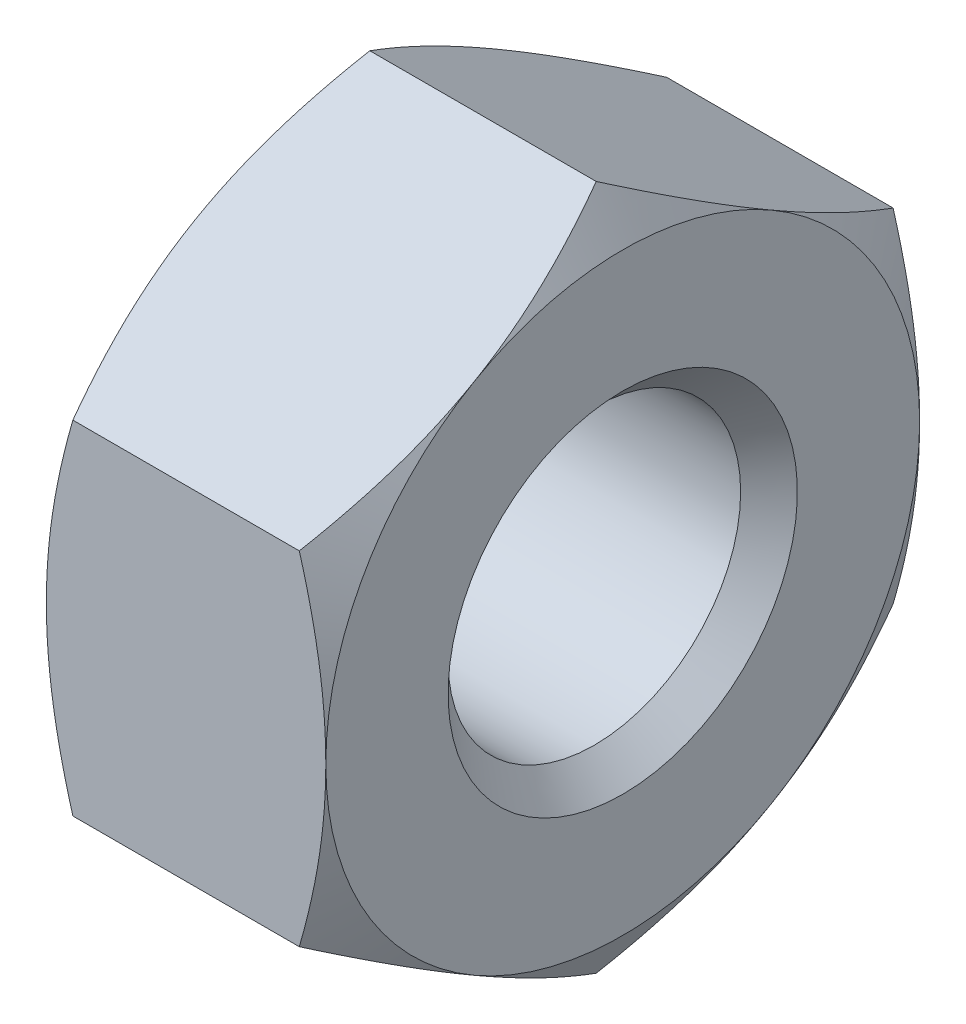
ISO-10303-21;
HEADER;
FILE_DESCRIPTION(('STEP AP214'),'2;1');
FILE_NAME('part.step','',(''),(''),'','','');
FILE_SCHEMA(('AUTOMOTIVE_DESIGN { 1 0 10303 214 1 1 1 1 }'));
ENDSEC;
DATA;
#1=APPLICATION_CONTEXT('core data for automotive mechanical design processes');
#2=APPLICATION_PROTOCOL_DEFINITION('international standard','automotive_design',2000,#1);
#3=PRODUCT_CONTEXT('',#1,'mechanical');
#4=PRODUCT('Part','Part','',(#3));
#5=PRODUCT_RELATED_PRODUCT_CATEGORY('part','',(#4));
#6=PRODUCT_DEFINITION_FORMATION('','',#4);
#7=PRODUCT_DEFINITION_CONTEXT('part definition',#1,'design');
#8=PRODUCT_DEFINITION('design','',#6,#7);
#9=PRODUCT_DEFINITION_SHAPE('','',#8);
#10=(LENGTH_UNIT() NAMED_UNIT(*) SI_UNIT(.MILLI.,.METRE.));
#11=(NAMED_UNIT(*) PLANE_ANGLE_UNIT() SI_UNIT($,.RADIAN.));
#12=(NAMED_UNIT(*) SI_UNIT($,.STERADIAN.) SOLID_ANGLE_UNIT());
#13=UNCERTAINTY_MEASURE_WITH_UNIT(LENGTH_MEASURE(1.E-05),#10,'distance_accuracy_value','');
#14=(GEOMETRIC_REPRESENTATION_CONTEXT(3) GLOBAL_UNCERTAINTY_ASSIGNED_CONTEXT((#13)) GLOBAL_UNIT_ASSIGNED_CONTEXT((#10,
#11,#12)) REPRESENTATION_CONTEXT('',''));
#15=CARTESIAN_POINT('',(0.,0.,0.));
#16=DIRECTION('',(0.,0.,1.));
#17=DIRECTION('',(1.,0.,0.));
#18=AXIS2_PLACEMENT_3D('',#15,#16,#17);
#19=CARTESIAN_POINT('',(9.,-4.90747728811182,8.5));
#20=DIRECTION('',(0.,0.866025403784439,-0.5));
#21=DIRECTION('',(0.,0.5,0.866025403784439));
#22=AXIS2_PLACEMENT_3D('',#19,#20,#21);
#23=PLANE('',#22);
#24=CARTESIAN_POINT('',(7.24081062144556,-9.81495457622367,0.));
#25=CARTESIAN_POINT('',(7.60930231810988,-9.17670823543381,1.1054750899929));
#26=CARTESIAN_POINT('',(7.79556483655696,-8.60066608617602,2.10320935980858));
#27=CARTESIAN_POINT('',(8.,-7.96842256281222,3.19828726503103));
#28=CARTESIAN_POINT('',(8.,-7.36121593216773,4.25));
#29=B_SPLINE_CURVE_WITH_KNOTS('',2,(#24,#25,#26,#27,#28),.UNSPECIFIED.,.F.,.F.,(3,2,3),(0.,0.5,
1.),.UNSPECIFIED.);
#30=CARTESIAN_POINT('',(7.24081062144515,-9.81495457622364,0.));
#31=VERTEX_POINT('',#30);
#32=CARTESIAN_POINT('',(8.,-7.36121593216773,4.25));
#33=VERTEX_POINT('',#32);
#34=EDGE_CURVE('E264',#31,#33,#29,.T.);
#35=ORIENTED_EDGE('',*,*,#34,.T.);
#36=CARTESIAN_POINT('',(8.,-7.36121593216773,4.25));
#37=CARTESIAN_POINT('',(8.,-6.7535269822711,5.30254813641915));
#38=CARTESIAN_POINT('',(7.79505900942023,-6.12020203529756,6.39949912227817));
#39=CARTESIAN_POINT('',(7.60897961351255,-5.5451646881436,7.39549302379846));
#40=CARTESIAN_POINT('',(7.24081062144536,-4.9074772881118,8.50000000000003));
#41=B_SPLINE_CURVE_WITH_KNOTS('',2,(#36,#37,#38,#39,#40),.UNSPECIFIED.,.F.,.F.,(3,2,3),(0.,0.5,
1.),.UNSPECIFIED.);
#42=CARTESIAN_POINT('',(7.24081062144515,-4.90747728811182,8.5));
#43=VERTEX_POINT('',#42);
#44=EDGE_CURVE('E127',#33,#43,#41,.T.);
#45=ORIENTED_EDGE('',*,*,#44,.T.);
#46=DIRECTION('',(-1.,0.,0.));
#47=VECTOR('',#46,1.);
#48=CARTESIAN_POINT('',(9.,-4.90747728811182,8.5));
#49=LINE('',#48,#47);
#50=CARTESIAN_POINT('',(0.759189378554848,-4.90747728811182,8.5));
#51=VERTEX_POINT('',#50);
#52=EDGE_CURVE('E125',#43,#51,#49,.T.);
#53=ORIENTED_EDGE('',*,*,#52,.T.);
#54=CARTESIAN_POINT('',(0.759189378554435,-4.90747728811179,8.50000000000005));
#55=CARTESIAN_POINT('',(0.390697681890106,-5.54572362890165,7.39452491000709));
#56=CARTESIAN_POINT('',(0.204435163443026,-6.12176577815945,6.39679064019141));
#57=CARTESIAN_POINT('',(0.,-6.75400930152325,5.30171273496894));
#58=CARTESIAN_POINT('',(0.,-7.36121593216773,4.25));
#59=B_SPLINE_CURVE_WITH_KNOTS('',2,(#54,#55,#56,#57,#58),.UNSPECIFIED.,.F.,.F.,(3,2,3),(0.,0.5,
1.),.UNSPECIFIED.);
#60=CARTESIAN_POINT('',(0.,-7.36121593216773,4.25));
#61=VERTEX_POINT('',#60);
#62=EDGE_CURVE('E108',#51,#61,#59,.T.);
#63=ORIENTED_EDGE('',*,*,#62,.T.);
#64=CARTESIAN_POINT('',(0.,-7.36121593216773,4.25));
#65=CARTESIAN_POINT('',(0.,-7.96890488206094,3.19745186358678));
#66=CARTESIAN_POINT('',(0.204940990579756,-8.6022298290379,2.10050087772182));
#67=CARTESIAN_POINT('',(0.391020386485147,-9.1772671761879,1.10450697620841));
#68=CARTESIAN_POINT('',(0.759189378554636,-9.81495457622365,0.));
#69=B_SPLINE_CURVE_WITH_KNOTS('',2,(#64,#65,#66,#67,#68),.UNSPECIFIED.,.F.,.F.,(3,2,3),(0.,0.5,
1.),.UNSPECIFIED.);
#70=CARTESIAN_POINT('',(0.759189378554846,-9.81495457622364,0.));
#71=VERTEX_POINT('',#70);
#72=EDGE_CURVE('E598',#61,#71,#69,.T.);
#73=ORIENTED_EDGE('',*,*,#72,.T.);
#74=DIRECTION('',(-1.,0.,0.));
#75=VECTOR('',#74,1.);
#76=CARTESIAN_POINT('',(9.,-9.81495457622364,0.));
#77=LINE('',#76,#75);
#78=EDGE_CURVE('E269',#31,#71,#77,.T.);
#79=ORIENTED_EDGE('',*,*,#78,.F.);
#80=EDGE_LOOP('',(#35,#45,#53,#63,#73,#79));
#81=FACE_BOUND('',#80,.T.);
#82=ADVANCED_FACE('F15',(#81),#23,.F.);
#83=CARTESIAN_POINT('',(9.,9.81495457622364,0.));
#84=DIRECTION('',(0.,-0.866025403784439,-0.5));
#85=DIRECTION('',(0.,0.5,-0.866025403784439));
#86=AXIS2_PLACEMENT_3D('',#83,#84,#85);
#87=PLANE('',#86);
#88=CARTESIAN_POINT('',(7.24081062144556,4.90747728811179,8.50000000000006));
#89=CARTESIAN_POINT('',(7.60930231810252,5.5457236288889,7.39452491002918));
#90=CARTESIAN_POINT('',(7.79556483655697,6.12176577815944,6.39679064019142));
#91=CARTESIAN_POINT('',(8.,6.75400930151223,5.30171273498803));
#92=CARTESIAN_POINT('',(8.,7.36121593216773,4.25));
#93=B_SPLINE_CURVE_WITH_KNOTS('',2,(#88,#89,#90,#91,#92),.UNSPECIFIED.,.F.,.F.,(3,2,3),(0.,0.5,
1.),.UNSPECIFIED.);
#94=CARTESIAN_POINT('',(7.24081062144515,4.90747728811182,8.5));
#95=VERTEX_POINT('',#94);
#96=CARTESIAN_POINT('',(8.,7.36121593216773,4.25));
#97=VERTEX_POINT('',#96);
#98=EDGE_CURVE('E296',#95,#97,#93,.T.);
#99=ORIENTED_EDGE('',*,*,#98,.T.);
#100=CARTESIAN_POINT('',(8.,7.36121593216773,4.25));
#101=CARTESIAN_POINT('',(8.,7.9689048820607,3.1974518635872));
#102=CARTESIAN_POINT('',(7.79505900942023,8.6022298290379,2.10050087772182));
#103=CARTESIAN_POINT('',(7.60897961351501,9.17726717618759,1.10450697620893));
#104=CARTESIAN_POINT('',(7.24081062144536,9.81495457622366,0.));
#105=B_SPLINE_CURVE_WITH_KNOTS('',2,(#100,#101,#102,#103,#104),.UNSPECIFIED.,.F.,.F.,(3,2,3),
(0.,0.5,1.),.UNSPECIFIED.);
#106=CARTESIAN_POINT('',(7.24081062144516,9.81495457622364,0.));
#107=VERTEX_POINT('',#106);
#108=EDGE_CURVE('E9',#97,#107,#105,.T.);
#109=ORIENTED_EDGE('',*,*,#108,.T.);
#110=DIRECTION('',(-1.,0.,0.));
#111=VECTOR('',#110,1.);
#112=CARTESIAN_POINT('',(9.,9.81495457622364,0.));
#113=LINE('',#112,#111);
#114=CARTESIAN_POINT('',(0.759189378554848,9.81495457622364,0.));
#115=VERTEX_POINT('',#114);
#116=EDGE_CURVE('E673',#107,#115,#113,.T.);
#117=ORIENTED_EDGE('',*,*,#116,.T.);
#118=CARTESIAN_POINT('',(0.759189378554426,9.81495457622367,0.));
#119=CARTESIAN_POINT('',(0.390697681889936,9.17670823543351,1.10547508999342));
#120=CARTESIAN_POINT('',(0.204435163443026,8.60066608617601,2.10320935980859));
#121=CARTESIAN_POINT('',(0.,7.96842256281196,3.19828726503148));
#122=CARTESIAN_POINT('',(0.,7.36121593216773,4.25));
#123=B_SPLINE_CURVE_WITH_KNOTS('',2,(#118,#119,#120,#121,#122),.UNSPECIFIED.,.F.,.F.,(3,2,3),
(0.,0.5,1.),.UNSPECIFIED.);
#124=CARTESIAN_POINT('',(0.,7.36121593216773,4.25));
#125=VERTEX_POINT('',#124);
#126=EDGE_CURVE('E464',#115,#125,#123,.T.);
#127=ORIENTED_EDGE('',*,*,#126,.T.);
#128=CARTESIAN_POINT('',(0.,7.36121593216773,4.25));
#129=CARTESIAN_POINT('',(0.,6.75352698226717,5.30254813642595));
#130=CARTESIAN_POINT('',(0.204940990579766,6.12020203529756,6.39949912227817));
#131=CARTESIAN_POINT('',(0.391020386490066,5.54516468813905,7.39549302380633));
#132=CARTESIAN_POINT('',(0.759189378554636,4.9074772881118,8.50000000000003));
#133=B_SPLINE_CURVE_WITH_KNOTS('',2,(#128,#129,#130,#131,#132),.UNSPECIFIED.,.F.,.F.,(3,2,3),
(0.,0.5,1.),.UNSPECIFIED.);
#134=CARTESIAN_POINT('',(0.759189378554848,4.90747728811182,8.5));
#135=VERTEX_POINT('',#134);
#136=EDGE_CURVE('E336',#125,#135,#133,.T.);
#137=ORIENTED_EDGE('',*,*,#136,.T.);
#138=DIRECTION('',(-1.,0.,0.));
#139=VECTOR('',#138,1.);
#140=CARTESIAN_POINT('',(9.,4.90747728811182,8.5));
#141=LINE('',#140,#139);
#142=EDGE_CURVE('E357',#95,#135,#141,.T.);
#143=ORIENTED_EDGE('',*,*,#142,.F.);
#144=EDGE_LOOP('',(#99,#109,#117,#127,#137,#143));
#145=FACE_BOUND('',#144,.T.);
#146=ADVANCED_FACE('F236',(#145),#87,.F.);
#147=CARTESIAN_POINT('',(8.,0.,0.));
#148=DIRECTION('',(-1.,0.,0.));
#149=DIRECTION('',(0.,-1.,0.));
#150=AXIS2_PLACEMENT_3D('',#147,#148,#149);
#151=CONICAL_SURFACE('',#150,8.5,1.0471975511966);
#152=CARTESIAN_POINT('',(8.,7.36121593216773,-4.25));
#153=CARTESIAN_POINT('',(8.,6.75352698226742,-5.30254813642552));
#154=CARTESIAN_POINT('',(7.79505900942023,6.12020203529756,-6.39949912227817));
#155=CARTESIAN_POINT('',(7.6089796135101,5.54516468813936,-7.3954930238058));
#156=CARTESIAN_POINT('',(7.24081062144536,4.9074772881118,-8.50000000000003));
#157=B_SPLINE_CURVE_WITH_KNOTS('',2,(#152,#153,#154,#155,#156),.UNSPECIFIED.,.F.,.F.,(3,2,3),
(0.,0.5,1.),.UNSPECIFIED.);
#158=CARTESIAN_POINT('',(8.,7.36121593216773,-4.25));
#159=VERTEX_POINT('',#158);
#160=CARTESIAN_POINT('',(7.24081062144515,4.90747728811182,-8.5));
#161=VERTEX_POINT('',#160);
#162=EDGE_CURVE('E364',#159,#161,#157,.T.);
#163=ORIENTED_EDGE('',*,*,#162,.F.);
#164=CARTESIAN_POINT('',(8.,0.,0.));
#165=DIRECTION('',(1.,0.,0.));
#166=DIRECTION('',(0.,1.,0.));
#167=AXIS2_PLACEMENT_3D('',#164,#165,#166);
#168=CIRCLE('',#167,8.5);
#169=CARTESIAN_POINT('',(8.,0.,-8.5));
#170=VERTEX_POINT('',#169);
#171=EDGE_CURVE('E382',#170,#159,#168,.T.);
#172=ORIENTED_EDGE('',*,*,#171,.F.);
#173=CARTESIAN_POINT('',(7.24081062144515,4.90747728811182,-8.5));
#174=CARTESIAN_POINT('',(7.6074253900606,3.63748647601769,-8.5));
#175=CARTESIAN_POINT('',(7.79362426317789,2.49087901791266,-8.5));
#176=CARTESIAN_POINT('',(8.,1.22002299687172,-8.5));
#177=CARTESIAN_POINT('',(8.,0.,-8.5));
#178=B_SPLINE_CURVE_WITH_KNOTS('',2,(#173,#174,#175,#176,#177),.UNSPECIFIED.,.F.,.F.,(3,2,3),
(0.,0.5,1.),.UNSPECIFIED.);
#179=EDGE_CURVE('E455',#161,#170,#178,.T.);
#180=ORIENTED_EDGE('',*,*,#179,.F.);
#181=EDGE_LOOP('',(#163,#172,#180));
#182=FACE_BOUND('',#181,.T.);
#183=ADVANCED_FACE('F307',(#182),#151,.T.);
#184=CARTESIAN_POINT('',(8.,0.,0.));
#185=DIRECTION('',(-1.,0.,0.));
#186=DIRECTION('',(0.,-1.,0.));
#187=AXIS2_PLACEMENT_3D('',#184,#185,#186);
#188=CONICAL_SURFACE('',#187,8.5,1.0471975511966);
#189=CARTESIAN_POINT('',(7.24081062144556,9.81495457622367,0.));
#190=CARTESIAN_POINT('',(7.60930231810777,9.17670823543746,-1.10547508998657));
#191=CARTESIAN_POINT('',(7.79556483655696,8.60066608617602,-2.10320935980858));
#192=CARTESIAN_POINT('',(8.,7.96842256281538,-3.19828726502556));
#193=CARTESIAN_POINT('',(8.,7.36121593216773,-4.25));
#194=B_SPLINE_CURVE_WITH_KNOTS('',2,(#189,#190,#191,#192,#193),.UNSPECIFIED.,.F.,.F.,(3,2,3),
(0.,0.5,1.),.UNSPECIFIED.);
#195=EDGE_CURVE('E652',#107,#159,#194,.T.);
#196=ORIENTED_EDGE('',*,*,#195,.F.);
#197=ORIENTED_EDGE('',*,*,#108,.F.);
#198=CARTESIAN_POINT('',(8.,0.,0.));
#199=DIRECTION('',(1.,0.,0.));
#200=DIRECTION('',(0.,1.,0.));
#201=AXIS2_PLACEMENT_3D('',#198,#199,#200);
#202=CIRCLE('',#201,8.5);
#203=EDGE_CURVE('E650',#159,#97,#202,.T.);
#204=ORIENTED_EDGE('',*,*,#203,.F.);
#205=EDGE_LOOP('',(#196,#197,#204));
#206=FACE_BOUND('',#205,.T.);
#207=ADVANCED_FACE('F163',(#206),#188,.T.);
#208=CARTESIAN_POINT('',(7.188,0.,0.));
#209=DIRECTION('',(1.,0.,0.));
#210=DIRECTION('',(0.,1.,0.));
#211=AXIS2_PLACEMENT_3D('',#208,#209,#210);
#212=CONICAL_SURFACE('',#211,4.188,0.785398163397448);
#213=CARTESIAN_POINT('',(7.188,0.,0.));
#214=DIRECTION('',(1.,0.,0.));
#215=DIRECTION('',(0.,1.,0.));
#216=AXIS2_PLACEMENT_3D('',#213,#214,#215);
#217=CIRCLE('',#216,4.188);
#218=CARTESIAN_POINT('',(7.188,4.188,0.));
#219=VERTEX_POINT('',#218);
#220=EDGE_CURVE('E27',#219,#219,#217,.T.);
#221=ORIENTED_EDGE('',*,*,#220,.F.);
#222=EDGE_LOOP('',(#221));
#223=FACE_BOUND('',#222,.T.);
#224=CARTESIAN_POINT('',(8.,0.,0.));
#225=DIRECTION('',(1.,0.,0.));
#226=DIRECTION('',(0.,1.,0.));
#227=AXIS2_PLACEMENT_3D('',#224,#225,#226);
#228=CIRCLE('',#227,5.);
#229=CARTESIAN_POINT('',(8.,5.,0.));
#230=VERTEX_POINT('',#229);
#231=EDGE_CURVE('E660',#230,#230,#228,.T.);
#232=ORIENTED_EDGE('',*,*,#231,.T.);
#233=EDGE_LOOP('',(#232));
#234=FACE_BOUND('',#233,.T.);
#235=ADVANCED_FACE('F481',(#223,#234),#212,.F.);
#236=CARTESIAN_POINT('',(8.,0.,0.));
#237=DIRECTION('',(1.,0.,0.));
#238=DIRECTION('',(0.,1.,0.));
#239=AXIS2_PLACEMENT_3D('',#236,#237,#238);
#240=CYLINDRICAL_SURFACE('',#239,4.188);
#241=CARTESIAN_POINT('',(0.812,0.,0.));
#242=DIRECTION('',(1.,0.,0.));
#243=DIRECTION('',(0.,1.,0.));
#244=AXIS2_PLACEMENT_3D('',#241,#242,#243);
#245=CIRCLE('',#244,4.188);
#246=CARTESIAN_POINT('',(0.812,4.188,0.));
#247=VERTEX_POINT('',#246);
#248=EDGE_CURVE('E928',#247,#247,#245,.T.);
#249=ORIENTED_EDGE('',*,*,#248,.F.);
#250=EDGE_LOOP('',(#249));
#251=FACE_BOUND('',#250,.T.);
#252=ORIENTED_EDGE('',*,*,#220,.T.);
#253=EDGE_LOOP('',(#252));
#254=FACE_BOUND('',#253,.T.);
#255=ADVANCED_FACE('F17',(#251,#254),#240,.F.);
#256=CARTESIAN_POINT('',(0.,0.,0.));
#257=DIRECTION('',(-1.,0.,0.));
#258=DIRECTION('',(0.,-1.,0.));
#259=AXIS2_PLACEMENT_3D('',#256,#257,#258);
#260=CONICAL_SURFACE('',#259,5.,0.785398163397448);
#261=CARTESIAN_POINT('',(0.,0.,0.));
#262=DIRECTION('',(1.,0.,0.));
#263=DIRECTION('',(0.,1.,0.));
#264=AXIS2_PLACEMENT_3D('',#261,#262,#263);
#265=CIRCLE('',#264,5.);
#266=CARTESIAN_POINT('',(0.,5.,0.));
#267=VERTEX_POINT('',#266);
#268=EDGE_CURVE('E121',#267,#267,#265,.T.);
#269=ORIENTED_EDGE('',*,*,#268,.F.);
#270=EDGE_LOOP('',(#269));
#271=FACE_BOUND('',#270,.T.);
#272=ORIENTED_EDGE('',*,*,#248,.T.);
#273=EDGE_LOOP('',(#272));
#274=FACE_BOUND('',#273,.T.);
#275=ADVANCED_FACE('F279',(#271,#274),#260,.F.);
#276=CARTESIAN_POINT('',(0.,8.5,0.));
#277=DIRECTION('',(-1.,0.,0.));
#278=DIRECTION('',(0.,-1.,0.));
#279=AXIS2_PLACEMENT_3D('',#276,#277,#278);
#280=PLANE('',#279);
#281=CARTESIAN_POINT('',(0.,0.,0.));
#282=DIRECTION('',(1.,0.,0.));
#283=DIRECTION('',(0.,1.,0.));
#284=AXIS2_PLACEMENT_3D('',#281,#282,#283);
#285=CIRCLE('',#284,8.5);
#286=CARTESIAN_POINT('',(0.,7.36121593216773,-4.25));
#287=VERTEX_POINT('',#286);
#288=EDGE_CURVE('E351',#287,#125,#285,.T.);
#289=ORIENTED_EDGE('',*,*,#288,.F.);
#290=CARTESIAN_POINT('',(0.,0.,0.));
#291=DIRECTION('',(1.,0.,0.));
#292=DIRECTION('',(0.,1.,0.));
#293=AXIS2_PLACEMENT_3D('',#290,#291,#292);
#294=CIRCLE('',#293,8.5);
#295=CARTESIAN_POINT('',(0.,0.,-8.5));
#296=VERTEX_POINT('',#295);
#297=EDGE_CURVE('E461',#296,#287,#294,.T.);
#298=ORIENTED_EDGE('',*,*,#297,.F.);
#299=CARTESIAN_POINT('',(0.,0.,0.));
#300=DIRECTION('',(1.,0.,0.));
#301=DIRECTION('',(0.,1.,0.));
#302=AXIS2_PLACEMENT_3D('',#299,#300,#301);
#303=CIRCLE('',#302,8.5);
#304=CARTESIAN_POINT('',(0.,-7.36121593216773,-4.25));
#305=VERTEX_POINT('',#304);
#306=EDGE_CURVE('E348',#305,#296,#303,.T.);
#307=ORIENTED_EDGE('',*,*,#306,.F.);
#308=CARTESIAN_POINT('',(0.,0.,0.));
#309=DIRECTION('',(1.,0.,0.));
#310=DIRECTION('',(0.,1.,0.));
#311=AXIS2_PLACEMENT_3D('',#308,#309,#310);
#312=CIRCLE('',#311,8.5);
#313=EDGE_CURVE('E626',#61,#305,#312,.T.);
#314=ORIENTED_EDGE('',*,*,#313,.F.);
#315=CARTESIAN_POINT('',(0.,0.,0.));
#316=DIRECTION('',(1.,0.,0.));
#317=DIRECTION('',(0.,1.,0.));
#318=AXIS2_PLACEMENT_3D('',#315,#316,#317);
#319=CIRCLE('',#318,8.5);
#320=CARTESIAN_POINT('',(0.,0.,8.5));
#321=VERTEX_POINT('',#320);
#322=EDGE_CURVE('E116',#321,#61,#319,.T.);
#323=ORIENTED_EDGE('',*,*,#322,.F.);
#324=CARTESIAN_POINT('',(0.,0.,0.));
#325=DIRECTION('',(1.,0.,0.));
#326=DIRECTION('',(0.,1.,0.));
#327=AXIS2_PLACEMENT_3D('',#324,#325,#326);
#328=CIRCLE('',#327,8.5);
#329=EDGE_CURVE('E341',#125,#321,#328,.T.);
#330=ORIENTED_EDGE('',*,*,#329,.F.);
#331=EDGE_LOOP('',(#289,#298,#307,#314,#323,#330));
#332=FACE_BOUND('',#331,.T.);
#333=ORIENTED_EDGE('',*,*,#268,.T.);
#334=EDGE_LOOP('',(#333));
#335=FACE_BOUND('',#334,.T.);
#336=ADVANCED_FACE('F482',(#332,#335),#280,.T.);
#337=CARTESIAN_POINT('',(4.,0.,0.));
#338=DIRECTION('',(1.,0.,0.));
#339=DIRECTION('',(0.,1.,0.));
#340=AXIS2_PLACEMENT_3D('',#337,#338,#339);
#341=CONICAL_SURFACE('',#340,15.4282032302755,1.0471975511966);
#342=CARTESIAN_POINT('',(0.,0.,8.5));
#343=CARTESIAN_POINT('',(0.,-1.21095318018135,8.5));
#344=CARTESIAN_POINT('',(0.20342213939837,-2.47262590667738,8.5));
#345=CARTESIAN_POINT('',(0.389540335438549,-3.62697544081862,8.5));
#346=CARTESIAN_POINT('',(0.759189378554818,-4.90747728811183,8.5));
#347=B_SPLINE_CURVE_WITH_KNOTS('',2,(#342,#343,#344,#345,#346),.UNSPECIFIED.,.F.,.F.,(3,2,3),
(0.,0.5,1.),.UNSPECIFIED.);
#348=EDGE_CURVE('E113',#321,#51,#347,.T.);
#349=ORIENTED_EDGE('',*,*,#348,.F.);
#350=ORIENTED_EDGE('',*,*,#322,.T.);
#351=ORIENTED_EDGE('',*,*,#62,.F.);
#352=EDGE_LOOP('',(#349,#350,#351));
#353=FACE_BOUND('',#352,.T.);
#354=ADVANCED_FACE('F111',(#353),#341,.T.);
#355=CARTESIAN_POINT('',(4.,0.,0.));
#356=DIRECTION('',(1.,0.,0.));
#357=DIRECTION('',(0.,1.,0.));
#358=AXIS2_PLACEMENT_3D('',#355,#356,#357);
#359=CONICAL_SURFACE('',#358,15.4282032302755,1.0471975511966);
#360=CARTESIAN_POINT('',(0.759189378554818,-4.90747728811183,-8.5));
#361=CARTESIAN_POINT('',(0.389711694484509,-3.62756904596652,-8.5));
#362=CARTESIAN_POINT('',(0.20342213939837,-2.47262590667738,-8.5));
#363=CARTESIAN_POINT('',(0.,-1.21146553636551,-8.5));
#364=CARTESIAN_POINT('',(0.,0.,-8.5));
#365=B_SPLINE_CURVE_WITH_KNOTS('',2,(#360,#361,#362,#363,#364),.UNSPECIFIED.,.F.,.F.,(3,2,3),
(0.,0.5,1.),.UNSPECIFIED.);
#366=CARTESIAN_POINT('',(0.759189378554848,-4.90747728811182,-8.5));
#367=VERTEX_POINT('',#366);
#368=EDGE_CURVE('E678',#367,#296,#365,.T.);
#369=ORIENTED_EDGE('',*,*,#368,.F.);
#370=CARTESIAN_POINT('',(0.,-7.36121593216773,-4.25));
#371=CARTESIAN_POINT('',(0.,-6.75352698227349,-5.302548136415));
#372=CARTESIAN_POINT('',(0.204940990579756,-6.12020203529756,-6.39949912227817));
#373=CARTESIAN_POINT('',(0.391020386485837,-5.54516468814638,-7.39549302379364));
#374=CARTESIAN_POINT('',(0.759189378554636,-4.9074772881118,-8.50000000000003));
#375=B_SPLINE_CURVE_WITH_KNOTS('',2,(#370,#371,#372,#373,#374),.UNSPECIFIED.,.F.,.F.,(3,2,3),
(0.,0.5,1.),.UNSPECIFIED.);
#376=EDGE_CURVE('E418',#305,#367,#375,.T.);
#377=ORIENTED_EDGE('',*,*,#376,.F.);
#378=ORIENTED_EDGE('',*,*,#306,.T.);
#379=EDGE_LOOP('',(#369,#377,#378));
#380=FACE_BOUND('',#379,.T.);
#381=ADVANCED_FACE('F431',(#380),#359,.T.);
#382=CARTESIAN_POINT('',(4.,0.,0.));
#383=DIRECTION('',(1.,0.,0.));
#384=DIRECTION('',(0.,1.,0.));
#385=AXIS2_PLACEMENT_3D('',#382,#383,#384);
#386=CONICAL_SURFACE('',#385,15.4282032302755,1.0471975511966);
#387=ORIENTED_EDGE('',*,*,#136,.F.);
#388=ORIENTED_EDGE('',*,*,#329,.T.);
#389=CARTESIAN_POINT('',(0.759189378554849,4.90747728811182,8.5));
#390=CARTESIAN_POINT('',(0.39257460993939,3.63748647601765,8.5));
#391=CARTESIAN_POINT('',(0.206375736822098,2.49087901791266,8.5));
#392=CARTESIAN_POINT('',(0.,1.22002299687173,8.5));
#393=CARTESIAN_POINT('',(0.,0.,8.5));
#394=B_SPLINE_CURVE_WITH_KNOTS('',2,(#389,#390,#391,#392,#393),.UNSPECIFIED.,.F.,.F.,(3,2,3),
(0.,0.5,1.),.UNSPECIFIED.);
#395=EDGE_CURVE('E138',#135,#321,#394,.T.);
#396=ORIENTED_EDGE('',*,*,#395,.F.);
#397=EDGE_LOOP('',(#387,#388,#396));
#398=FACE_BOUND('',#397,.T.);
#399=ADVANCED_FACE('F308',(#398),#386,.T.);
#400=CARTESIAN_POINT('',(9.,4.90747728811182,-8.5));
#401=DIRECTION('',(0.,-0.866025403784439,0.5));
#402=DIRECTION('',(0.,-0.5,-0.866025403784439));
#403=AXIS2_PLACEMENT_3D('',#400,#401,#402);
#404=PLANE('',#403);
#405=ORIENTED_EDGE('',*,*,#195,.T.);
#406=ORIENTED_EDGE('',*,*,#162,.T.);
#407=DIRECTION('',(-1.,0.,0.));
#408=VECTOR('',#407,1.);
#409=CARTESIAN_POINT('',(9.,4.90747728811182,-8.5));
#410=LINE('',#409,#408);
#411=CARTESIAN_POINT('',(0.759189378554848,4.90747728811182,-8.5));
#412=VERTEX_POINT('',#411);
#413=EDGE_CURVE('E676',#161,#412,#410,.T.);
#414=ORIENTED_EDGE('',*,*,#413,.T.);
#415=CARTESIAN_POINT('',(0.759189378554435,4.90747728811179,-8.50000000000005));
#416=CARTESIAN_POINT('',(0.390697681891134,5.54572362889988,-7.39452491001016));
#417=CARTESIAN_POINT('',(0.204435163443026,6.12176577815945,-6.39679064019141));
#418=CARTESIAN_POINT('',(0.,6.75400930152171,-5.30171273497162));
#419=CARTESIAN_POINT('',(0.,7.36121593216773,-4.25));
#420=B_SPLINE_CURVE_WITH_KNOTS('',2,(#415,#416,#417,#418,#419),.UNSPECIFIED.,.F.,.F.,(3,2,3),
(0.,0.5,1.),.UNSPECIFIED.);
#421=EDGE_CURVE('E579',#412,#287,#420,.T.);
#422=ORIENTED_EDGE('',*,*,#421,.T.);
#423=CARTESIAN_POINT('',(0.,7.36121593216773,-4.25));
#424=CARTESIAN_POINT('',(0.,7.96890488206095,-3.19745186358676));
#425=CARTESIAN_POINT('',(0.204940990579756,8.6022298290379,-2.10050087772182));
#426=CARTESIAN_POINT('',(0.391020386485147,9.1772671761879,-1.10450697620841));
#427=CARTESIAN_POINT('',(0.759189378554636,9.81495457622365,0.));
#428=B_SPLINE_CURVE_WITH_KNOTS('',2,(#423,#424,#425,#426,#427),.UNSPECIFIED.,.F.,.F.,(3,2,3),
(0.,0.5,1.),.UNSPECIFIED.);
#429=EDGE_CURVE('E354',#287,#115,#428,.T.);
#430=ORIENTED_EDGE('',*,*,#429,.T.);
#431=ORIENTED_EDGE('',*,*,#116,.F.);
#432=EDGE_LOOP('',(#405,#406,#414,#422,#430,#431));
#433=FACE_BOUND('',#432,.T.);
#434=ADVANCED_FACE('F160',(#433),#404,.F.);
#435=CARTESIAN_POINT('',(9.,-4.90747728811182,-8.5));
#436=DIRECTION('',(0.,0.,1.));
#437=DIRECTION('',(1.,0.,0.));
#438=AXIS2_PLACEMENT_3D('',#435,#436,#437);
#439=PLANE('',#438);
#440=ORIENTED_EDGE('',*,*,#179,.T.);
#441=CARTESIAN_POINT('',(8.,0.,-8.5));
#442=CARTESIAN_POINT('',(8.,-1.21095318019401,-8.5));
#443=CARTESIAN_POINT('',(7.79657786060162,-2.47262590667738,-8.5));
#444=CARTESIAN_POINT('',(7.61045966455722,-3.62697544083326,-8.5));
#445=CARTESIAN_POINT('',(7.24081062144517,-4.90747728811183,-8.5));
#446=B_SPLINE_CURVE_WITH_KNOTS('',2,(#441,#442,#443,#444,#445),.UNSPECIFIED.,.F.,.F.,(3,2,3),
(0.,0.5,1.),.UNSPECIFIED.);
#447=CARTESIAN_POINT('',(7.24081062144515,-4.90747728811182,-8.5));
#448=VERTEX_POINT('',#447);
#449=EDGE_CURVE('E353',#170,#448,#446,.T.);
#450=ORIENTED_EDGE('',*,*,#449,.T.);
#451=DIRECTION('',(-1.,0.,0.));
#452=VECTOR('',#451,1.);
#453=CARTESIAN_POINT('',(9.,-4.90747728811182,-8.5));
#454=LINE('',#453,#452);
#455=EDGE_CURVE('E447',#448,#367,#454,.T.);
#456=ORIENTED_EDGE('',*,*,#455,.T.);
#457=ORIENTED_EDGE('',*,*,#368,.T.);
#458=CARTESIAN_POINT('',(0.,0.,-8.5));
#459=CARTESIAN_POINT('',(0.,1.21954849895072,-8.5));
#460=CARTESIAN_POINT('',(0.206375736822098,2.49087901791266,-8.5));
#461=CARTESIAN_POINT('',(0.39241582638787,3.63693643366038,-8.5));
#462=CARTESIAN_POINT('',(0.759189378554849,4.90747728811182,-8.5));
#463=B_SPLINE_CURVE_WITH_KNOTS('',2,(#458,#459,#460,#461,#462),.UNSPECIFIED.,.F.,.F.,(3,2,3),
(0.,0.5,1.),.UNSPECIFIED.);
#464=EDGE_CURVE('E465',#296,#412,#463,.T.);
#465=ORIENTED_EDGE('',*,*,#464,.T.);
#466=ORIENTED_EDGE('',*,*,#413,.F.);
#467=EDGE_LOOP('',(#440,#450,#456,#457,#465,#466));
#468=FACE_BOUND('',#467,.T.);
#469=ADVANCED_FACE('F473',(#468),#439,.F.);
#470=CARTESIAN_POINT('',(9.,-9.81495457622364,0.));
#471=DIRECTION('',(0.,0.866025403784439,0.5));
#472=DIRECTION('',(0.,-0.5,0.866025403784439));
#473=AXIS2_PLACEMENT_3D('',#470,#471,#472);
#474=PLANE('',#473);
#475=CARTESIAN_POINT('',(7.24081062144556,-4.90747728811179,-8.50000000000006));
#476=CARTESIAN_POINT('',(7.60930231810532,-5.54572362889375,-7.39452491002078));
#477=CARTESIAN_POINT('',(7.79556483655696,-6.12176577815945,-6.39679064019141));
#478=CARTESIAN_POINT('',(8.,-6.75400930151642,-5.30171273498078));
#479=CARTESIAN_POINT('',(8.,-7.36121593216773,-4.25));
#480=B_SPLINE_CURVE_WITH_KNOTS('',2,(#475,#476,#477,#478,#479),.UNSPECIFIED.,.F.,.F.,(3,2,3),
(0.,0.5,1.),.UNSPECIFIED.);
#481=CARTESIAN_POINT('',(8.,-7.36121593216773,-4.25));
#482=VERTEX_POINT('',#481);
#483=EDGE_CURVE('E410',#448,#482,#480,.T.);
#484=ORIENTED_EDGE('',*,*,#483,.T.);
#485=CARTESIAN_POINT('',(8.,-7.36121593216773,-4.25));
#486=CARTESIAN_POINT('',(8.,-7.96890488206881,-3.19745186357315));
#487=CARTESIAN_POINT('',(7.79505900942023,-8.6022298290379,-2.10050087772182));
#488=CARTESIAN_POINT('',(7.60897961350959,-9.17726717619698,-1.10450697619267));
#489=CARTESIAN_POINT('',(7.24081062144536,-9.81495457622366,0.));
#490=B_SPLINE_CURVE_WITH_KNOTS('',2,(#485,#486,#487,#488,#489),.UNSPECIFIED.,.F.,.F.,(3,2,3),
(0.,0.5,1.),.UNSPECIFIED.);
#491=EDGE_CURVE('E940',#482,#31,#490,.T.);
#492=ORIENTED_EDGE('',*,*,#491,.T.);
#493=ORIENTED_EDGE('',*,*,#78,.T.);
#494=CARTESIAN_POINT('',(0.759189378554426,-9.81495457622367,0.));
#495=CARTESIAN_POINT('',(0.390697681894155,-9.17670823544082,-1.10547508998076));
#496=CARTESIAN_POINT('',(0.204435163443026,-8.60066608617601,-2.10320935980859));
#497=CARTESIAN_POINT('',(0.,-7.96842256281827,-3.19828726502055));
#498=CARTESIAN_POINT('',(0.,-7.36121593216773,-4.25));
#499=B_SPLINE_CURVE_WITH_KNOTS('',2,(#494,#495,#496,#497,#498),.UNSPECIFIED.,.F.,.F.,(3,2,3),
(0.,0.5,1.),.UNSPECIFIED.);
#500=EDGE_CURVE('E132',#71,#305,#499,.T.);
#501=ORIENTED_EDGE('',*,*,#500,.T.);
#502=ORIENTED_EDGE('',*,*,#376,.T.);
#503=ORIENTED_EDGE('',*,*,#455,.F.);
#504=EDGE_LOOP('',(#484,#492,#493,#501,#502,#503));
#505=FACE_BOUND('',#504,.T.);
#506=ADVANCED_FACE('F310',(#505),#474,.F.);
#507=CARTESIAN_POINT('',(8.,5.,0.));
#508=DIRECTION('',(1.,0.,0.));
#509=DIRECTION('',(0.,1.,0.));
#510=AXIS2_PLACEMENT_3D('',#507,#508,#509);
#511=PLANE('',#510);
#512=ORIENTED_EDGE('',*,*,#231,.F.);
#513=EDGE_LOOP('',(#512));
#514=FACE_BOUND('',#513,.T.);
#515=ORIENTED_EDGE('',*,*,#171,.T.);
#516=ORIENTED_EDGE('',*,*,#203,.T.);
#517=CARTESIAN_POINT('',(8.,0.,0.));
#518=DIRECTION('',(1.,0.,0.));
#519=DIRECTION('',(0.,1.,0.));
#520=AXIS2_PLACEMENT_3D('',#517,#518,#519);
#521=CIRCLE('',#520,8.5);
#522=CARTESIAN_POINT('',(8.,0.,8.5));
#523=VERTEX_POINT('',#522);
#524=EDGE_CURVE('E658',#97,#523,#521,.T.);
#525=ORIENTED_EDGE('',*,*,#524,.T.);
#526=CARTESIAN_POINT('',(8.,0.,0.));
#527=DIRECTION('',(1.,0.,0.));
#528=DIRECTION('',(0.,1.,0.));
#529=AXIS2_PLACEMENT_3D('',#526,#527,#528);
#530=CIRCLE('',#529,8.5);
#531=EDGE_CURVE('E670',#523,#33,#530,.T.);
#532=ORIENTED_EDGE('',*,*,#531,.T.);
#533=CARTESIAN_POINT('',(8.,0.,0.));
#534=DIRECTION('',(1.,0.,0.));
#535=DIRECTION('',(0.,1.,0.));
#536=AXIS2_PLACEMENT_3D('',#533,#534,#535);
#537=CIRCLE('',#536,8.5);
#538=EDGE_CURVE('E944',#33,#482,#537,.T.);
#539=ORIENTED_EDGE('',*,*,#538,.T.);
#540=CARTESIAN_POINT('',(8.,0.,0.));
#541=DIRECTION('',(1.,0.,0.));
#542=DIRECTION('',(0.,1.,0.));
#543=AXIS2_PLACEMENT_3D('',#540,#541,#542);
#544=CIRCLE('',#543,8.5);
#545=EDGE_CURVE('E402',#482,#170,#544,.T.);
#546=ORIENTED_EDGE('',*,*,#545,.T.);
#547=EDGE_LOOP('',(#515,#516,#525,#532,#539,#546));
#548=FACE_BOUND('',#547,.T.);
#549=ADVANCED_FACE('F208',(#514,#548),#511,.T.);
#550=CARTESIAN_POINT('',(8.,0.,0.));
#551=DIRECTION('',(-1.,0.,0.));
#552=DIRECTION('',(0.,-1.,0.));
#553=AXIS2_PLACEMENT_3D('',#550,#551,#552);
#554=CONICAL_SURFACE('',#553,8.5,1.0471975511966);
#555=ORIENTED_EDGE('',*,*,#491,.F.);
#556=ORIENTED_EDGE('',*,*,#538,.F.);
#557=ORIENTED_EDGE('',*,*,#34,.F.);
#558=EDGE_LOOP('',(#555,#556,#557));
#559=FACE_BOUND('',#558,.T.);
#560=ADVANCED_FACE('F205',(#559),#554,.T.);
#561=CARTESIAN_POINT('',(8.,0.,0.));
#562=DIRECTION('',(-1.,0.,0.));
#563=DIRECTION('',(0.,-1.,0.));
#564=AXIS2_PLACEMENT_3D('',#561,#562,#563);
#565=CONICAL_SURFACE('',#564,8.5,1.0471975511966);
#566=CARTESIAN_POINT('',(8.,0.,8.5));
#567=CARTESIAN_POINT('',(8.,1.21954849894328,8.5));
#568=CARTESIAN_POINT('',(7.79362426317789,2.49087901791266,8.5));
#569=CARTESIAN_POINT('',(7.6075841736146,3.63693643365182,8.5));
#570=CARTESIAN_POINT('',(7.24081062144515,4.90747728811182,8.5));
#571=B_SPLINE_CURVE_WITH_KNOTS('',2,(#566,#567,#568,#569,#570),.UNSPECIFIED.,.F.,.F.,(3,2,3),
(0.,0.5,1.),.UNSPECIFIED.);
#572=EDGE_CURVE('E189',#523,#95,#571,.T.);
#573=ORIENTED_EDGE('',*,*,#572,.F.);
#574=ORIENTED_EDGE('',*,*,#524,.F.);
#575=ORIENTED_EDGE('',*,*,#98,.F.);
#576=EDGE_LOOP('',(#573,#574,#575));
#577=FACE_BOUND('',#576,.T.);
#578=ADVANCED_FACE('F194',(#577),#565,.T.);
#579=CARTESIAN_POINT('',(8.,0.,0.));
#580=DIRECTION('',(-1.,0.,0.));
#581=DIRECTION('',(0.,-1.,0.));
#582=AXIS2_PLACEMENT_3D('',#579,#580,#581);
#583=CONICAL_SURFACE('',#582,8.5,1.0471975511966);
#584=CARTESIAN_POINT('',(7.24081062144517,-4.90747728811183,8.5));
#585=CARTESIAN_POINT('',(7.61028830551777,-3.62756904595859,8.5));
#586=CARTESIAN_POINT('',(7.79657786060162,-2.47262590667738,8.5));
#587=CARTESIAN_POINT('',(8.,-1.21146553635867,8.5));
#588=CARTESIAN_POINT('',(8.,0.,8.5));
#589=B_SPLINE_CURVE_WITH_KNOTS('',2,(#584,#585,#586,#587,#588),.UNSPECIFIED.,.F.,.F.,(3,2,3),
(0.,0.5,1.),.UNSPECIFIED.);
#590=EDGE_CURVE('E714',#43,#523,#589,.T.);
#591=ORIENTED_EDGE('',*,*,#590,.F.);
#592=ORIENTED_EDGE('',*,*,#44,.F.);
#593=ORIENTED_EDGE('',*,*,#531,.F.);
#594=EDGE_LOOP('',(#591,#592,#593));
#595=FACE_BOUND('',#594,.T.);
#596=ADVANCED_FACE('F204',(#595),#583,.T.);
#597=CARTESIAN_POINT('',(8.,0.,0.));
#598=DIRECTION('',(-1.,0.,0.));
#599=DIRECTION('',(0.,-1.,0.));
#600=AXIS2_PLACEMENT_3D('',#597,#598,#599);
#601=CONICAL_SURFACE('',#600,8.5,1.0471975511966);
#602=ORIENTED_EDGE('',*,*,#449,.F.);
#603=ORIENTED_EDGE('',*,*,#545,.F.);
#604=ORIENTED_EDGE('',*,*,#483,.F.);
#605=EDGE_LOOP('',(#602,#603,#604));
#606=FACE_BOUND('',#605,.T.);
#607=ADVANCED_FACE('F239',(#606),#601,.T.);
#608=CARTESIAN_POINT('',(4.,0.,0.));
#609=DIRECTION('',(1.,0.,0.));
#610=DIRECTION('',(0.,1.,0.));
#611=AXIS2_PLACEMENT_3D('',#608,#609,#610);
#612=CONICAL_SURFACE('',#611,15.4282032302755,1.0471975511966);
#613=ORIENTED_EDGE('',*,*,#126,.F.);
#614=ORIENTED_EDGE('',*,*,#429,.F.);
#615=ORIENTED_EDGE('',*,*,#288,.T.);
#616=EDGE_LOOP('',(#613,#614,#615));
#617=FACE_BOUND('',#616,.T.);
#618=ADVANCED_FACE('F237',(#617),#612,.T.);
#619=CARTESIAN_POINT('',(4.,0.,0.));
#620=DIRECTION('',(1.,0.,0.));
#621=DIRECTION('',(0.,1.,0.));
#622=AXIS2_PLACEMENT_3D('',#619,#620,#621);
#623=CONICAL_SURFACE('',#622,15.4282032302755,1.0471975511966);
#624=ORIENTED_EDGE('',*,*,#421,.F.);
#625=ORIENTED_EDGE('',*,*,#464,.F.);
#626=ORIENTED_EDGE('',*,*,#297,.T.);
#627=EDGE_LOOP('',(#624,#625,#626));
#628=FACE_BOUND('',#627,.T.);
#629=ADVANCED_FACE('F393',(#628),#623,.T.);
#630=CARTESIAN_POINT('',(4.,0.,0.));
#631=DIRECTION('',(1.,0.,0.));
#632=DIRECTION('',(0.,1.,0.));
#633=AXIS2_PLACEMENT_3D('',#630,#631,#632);
#634=CONICAL_SURFACE('',#633,15.4282032302755,1.0471975511966);
#635=ORIENTED_EDGE('',*,*,#500,.F.);
#636=ORIENTED_EDGE('',*,*,#72,.F.);
#637=ORIENTED_EDGE('',*,*,#313,.T.);
#638=EDGE_LOOP('',(#635,#636,#637));
#639=FACE_BOUND('',#638,.T.);
#640=ADVANCED_FACE('F159',(#639),#634,.T.);
#641=CARTESIAN_POINT('',(9.,4.90747728811182,8.5));
#642=DIRECTION('',(0.,0.,-1.));
#643=DIRECTION('',(-1.,0.,0.));
#644=AXIS2_PLACEMENT_3D('',#641,#642,#643);
#645=PLANE('',#644);
#646=ORIENTED_EDGE('',*,*,#590,.T.);
#647=ORIENTED_EDGE('',*,*,#572,.T.);
#648=ORIENTED_EDGE('',*,*,#142,.T.);
#649=ORIENTED_EDGE('',*,*,#395,.T.);
#650=ORIENTED_EDGE('',*,*,#348,.T.);
#651=ORIENTED_EDGE('',*,*,#52,.F.);
#652=EDGE_LOOP('',(#646,#647,#648,#649,#650,#651));
#653=FACE_BOUND('',#652,.T.);
#654=ADVANCED_FACE('F135',(#653),#645,.F.);
#655=CLOSED_SHELL('',(#82,#146,#183,#207,#235,#255,#275,#336,#354,#381,#399,#434,#469,#506,#549,
#560,#578,#596,#607,#618,#629,#640,#654));
#656=MANIFOLD_SOLID_BREP('B1',#655);
#657=ADVANCED_BREP_SHAPE_REPRESENTATION('',(#18,#656),#14);
#658=SHAPE_DEFINITION_REPRESENTATION(#9,#657);
ENDSEC;
END-ISO-10303-21;
